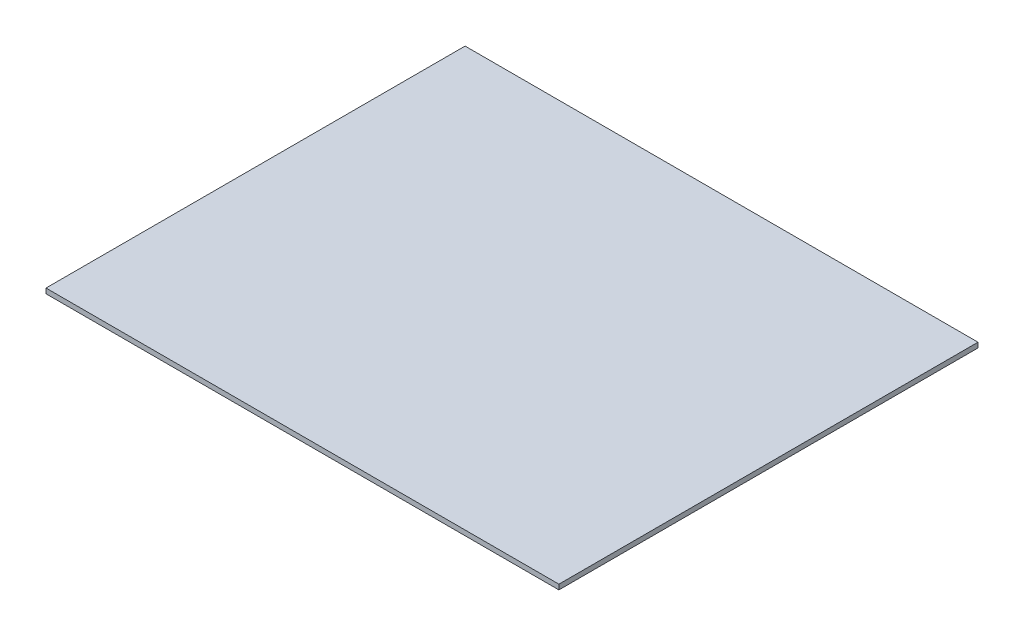
ISO-10303-21;
HEADER;
FILE_DESCRIPTION(('STEP AP214'),'2;1');
FILE_NAME('part.step','',(''),(''),'','','');
FILE_SCHEMA(('AUTOMOTIVE_DESIGN { 1 0 10303 214 1 1 1 1 }'));
ENDSEC;
DATA;
#1=APPLICATION_CONTEXT('core data for automotive mechanical design processes');
#2=APPLICATION_PROTOCOL_DEFINITION('international standard','automotive_design',2000,#1);
#3=PRODUCT_CONTEXT('',#1,'mechanical');
#4=PRODUCT('Part','Part','',(#3));
#5=PRODUCT_RELATED_PRODUCT_CATEGORY('part','',(#4));
#6=PRODUCT_DEFINITION_FORMATION('','',#4);
#7=PRODUCT_DEFINITION_CONTEXT('part definition',#1,'design');
#8=PRODUCT_DEFINITION('design','',#6,#7);
#9=PRODUCT_DEFINITION_SHAPE('','',#8);
#10=(LENGTH_UNIT() NAMED_UNIT(*) SI_UNIT(.MILLI.,.METRE.));
#11=(NAMED_UNIT(*) PLANE_ANGLE_UNIT() SI_UNIT($,.RADIAN.));
#12=(NAMED_UNIT(*) SI_UNIT($,.STERADIAN.) SOLID_ANGLE_UNIT());
#13=UNCERTAINTY_MEASURE_WITH_UNIT(LENGTH_MEASURE(1.E-05),#10,'distance_accuracy_value','');
#14=(GEOMETRIC_REPRESENTATION_CONTEXT(3) GLOBAL_UNCERTAINTY_ASSIGNED_CONTEXT((#13)) GLOBAL_UNIT_ASSIGNED_CONTEXT((#10,
#11,#12)) REPRESENTATION_CONTEXT('',''));
#15=CARTESIAN_POINT('',(0.,0.,0.));
#16=DIRECTION('',(0.,0.,1.));
#17=DIRECTION('',(1.,0.,0.));
#18=AXIS2_PLACEMENT_3D('',#15,#16,#17);
#19=CARTESIAN_POINT('',(205.,4.,-167.5));
#20=DIRECTION('',(-1.,0.,0.));
#21=DIRECTION('',(0.,0.,1.));
#22=AXIS2_PLACEMENT_3D('',#19,#20,#21);
#23=PLANE('',#22);
#24=DIRECTION('',(0.,0.,-1.));
#25=VECTOR('',#24,1.);
#26=CARTESIAN_POINT('',(205.,0.,-167.5));
#27=LINE('',#26,#25);
#28=CARTESIAN_POINT('',(205.,0.,167.5));
#29=VERTEX_POINT('',#28);
#30=CARTESIAN_POINT('',(205.,0.,-167.5));
#31=VERTEX_POINT('',#30);
#32=EDGE_CURVE('E101',#29,#31,#27,.T.);
#33=ORIENTED_EDGE('',*,*,#32,.T.);
#34=DIRECTION('',(0.,-1.,0.));
#35=VECTOR('',#34,1.);
#36=CARTESIAN_POINT('',(205.,4.,-167.5));
#37=LINE('',#36,#35);
#38=CARTESIAN_POINT('',(205.,4.,-167.5));
#39=VERTEX_POINT('',#38);
#40=EDGE_CURVE('E11',#39,#31,#37,.T.);
#41=ORIENTED_EDGE('',*,*,#40,.F.);
#42=DIRECTION('',(0.,0.,-1.));
#43=VECTOR('',#42,1.);
#44=CARTESIAN_POINT('',(205.,4.,-167.5));
#45=LINE('',#44,#43);
#46=CARTESIAN_POINT('',(205.,4.,167.5));
#47=VERTEX_POINT('',#46);
#48=EDGE_CURVE('E89',#47,#39,#45,.T.);
#49=ORIENTED_EDGE('',*,*,#48,.F.);
#50=DIRECTION('',(0.,-1.,0.));
#51=VECTOR('',#50,1.);
#52=CARTESIAN_POINT('',(205.,4.,167.5));
#53=LINE('',#52,#51);
#54=EDGE_CURVE('E97',#47,#29,#53,.T.);
#55=ORIENTED_EDGE('',*,*,#54,.T.);
#56=EDGE_LOOP('',(#33,#41,#49,#55));
#57=FACE_BOUND('',#56,.T.);
#58=ADVANCED_FACE('F38',(#57),#23,.F.);
#59=CARTESIAN_POINT('',(-205.,4.,-167.5));
#60=DIRECTION('',(0.,0.,1.));
#61=DIRECTION('',(1.,0.,0.));
#62=AXIS2_PLACEMENT_3D('',#59,#60,#61);
#63=PLANE('',#62);
#64=DIRECTION('',(-1.,0.,0.));
#65=VECTOR('',#64,1.);
#66=CARTESIAN_POINT('',(-205.,0.,-167.5));
#67=LINE('',#66,#65);
#68=CARTESIAN_POINT('',(-205.,0.,-167.5));
#69=VERTEX_POINT('',#68);
#70=EDGE_CURVE('E93',#31,#69,#67,.T.);
#71=ORIENTED_EDGE('',*,*,#70,.T.);
#72=DIRECTION('',(0.,-1.,0.));
#73=VECTOR('',#72,1.);
#74=CARTESIAN_POINT('',(-205.,4.,-167.5));
#75=LINE('',#74,#73);
#76=CARTESIAN_POINT('',(-205.,4.,-167.5));
#77=VERTEX_POINT('',#76);
#78=EDGE_CURVE('E46',#77,#69,#75,.T.);
#79=ORIENTED_EDGE('',*,*,#78,.F.);
#80=DIRECTION('',(-1.,0.,0.));
#81=VECTOR('',#80,1.);
#82=CARTESIAN_POINT('',(-205.,4.,-167.5));
#83=LINE('',#82,#81);
#84=EDGE_CURVE('E84',#39,#77,#83,.T.);
#85=ORIENTED_EDGE('',*,*,#84,.F.);
#86=ORIENTED_EDGE('',*,*,#40,.T.);
#87=EDGE_LOOP('',(#71,#79,#85,#86));
#88=FACE_BOUND('',#87,.T.);
#89=ADVANCED_FACE('F92',(#88),#63,.F.);
#90=CARTESIAN_POINT('',(-205.,4.,-167.5));
#91=DIRECTION('',(1.,0.,0.));
#92=DIRECTION('',(0.,0.,-1.));
#93=AXIS2_PLACEMENT_3D('',#90,#91,#92);
#94=PLANE('',#93);
#95=DIRECTION('',(0.,0.,1.));
#96=VECTOR('',#95,1.);
#97=CARTESIAN_POINT('',(-205.,0.,-167.5));
#98=LINE('',#97,#96);
#99=CARTESIAN_POINT('',(-205.,0.,167.5));
#100=VERTEX_POINT('',#99);
#101=EDGE_CURVE('E71',#69,#100,#98,.T.);
#102=ORIENTED_EDGE('',*,*,#101,.T.);
#103=DIRECTION('',(0.,-1.,0.));
#104=VECTOR('',#103,1.);
#105=CARTESIAN_POINT('',(-205.,4.,167.5));
#106=LINE('',#105,#104);
#107=CARTESIAN_POINT('',(-205.,4.,167.5));
#108=VERTEX_POINT('',#107);
#109=EDGE_CURVE('E94',#108,#100,#106,.T.);
#110=ORIENTED_EDGE('',*,*,#109,.F.);
#111=DIRECTION('',(0.,0.,1.));
#112=VECTOR('',#111,1.);
#113=CARTESIAN_POINT('',(-205.,4.,-167.5));
#114=LINE('',#113,#112);
#115=EDGE_CURVE('E87',#77,#108,#114,.T.);
#116=ORIENTED_EDGE('',*,*,#115,.F.);
#117=ORIENTED_EDGE('',*,*,#78,.T.);
#118=EDGE_LOOP('',(#102,#110,#116,#117));
#119=FACE_BOUND('',#118,.T.);
#120=ADVANCED_FACE('F95',(#119),#94,.F.);
#121=CARTESIAN_POINT('',(-205.,4.,167.5));
#122=DIRECTION('',(0.,0.,-1.));
#123=DIRECTION('',(-1.,0.,0.));
#124=AXIS2_PLACEMENT_3D('',#121,#122,#123);
#125=PLANE('',#124);
#126=DIRECTION('',(1.,0.,0.));
#127=VECTOR('',#126,1.);
#128=CARTESIAN_POINT('',(-205.,0.,167.5));
#129=LINE('',#128,#127);
#130=EDGE_CURVE('E77',#100,#29,#129,.T.);
#131=ORIENTED_EDGE('',*,*,#130,.T.);
#132=ORIENTED_EDGE('',*,*,#54,.F.);
#133=DIRECTION('',(1.,0.,0.));
#134=VECTOR('',#133,1.);
#135=CARTESIAN_POINT('',(-205.,4.,167.5));
#136=LINE('',#135,#134);
#137=EDGE_CURVE('E54',#108,#47,#136,.T.);
#138=ORIENTED_EDGE('',*,*,#137,.F.);
#139=ORIENTED_EDGE('',*,*,#109,.T.);
#140=EDGE_LOOP('',(#131,#132,#138,#139));
#141=FACE_BOUND('',#140,.T.);
#142=ADVANCED_FACE('F108',(#141),#125,.F.);
#143=CARTESIAN_POINT('',(0.,4.,0.));
#144=DIRECTION('',(0.,1.,0.));
#145=DIRECTION('',(0.,0.,1.));
#146=AXIS2_PLACEMENT_3D('',#143,#144,#145);
#147=PLANE('',#146);
#148=ORIENTED_EDGE('',*,*,#48,.T.);
#149=ORIENTED_EDGE('',*,*,#84,.T.);
#150=ORIENTED_EDGE('',*,*,#115,.T.);
#151=ORIENTED_EDGE('',*,*,#137,.T.);
#152=EDGE_LOOP('',(#148,#149,#150,#151));
#153=FACE_BOUND('',#152,.T.);
#154=ADVANCED_FACE('F85',(#153),#147,.T.);
#155=CARTESIAN_POINT('',(0.,0.,0.));
#156=DIRECTION('',(0.,1.,0.));
#157=DIRECTION('',(0.,0.,1.));
#158=AXIS2_PLACEMENT_3D('',#155,#156,#157);
#159=PLANE('',#158);
#160=ORIENTED_EDGE('',*,*,#32,.F.);
#161=ORIENTED_EDGE('',*,*,#130,.F.);
#162=ORIENTED_EDGE('',*,*,#101,.F.);
#163=ORIENTED_EDGE('',*,*,#70,.F.);
#164=EDGE_LOOP('',(#160,#161,#162,#163));
#165=FACE_BOUND('',#164,.T.);
#166=ADVANCED_FACE('F111',(#165),#159,.F.);
#167=CLOSED_SHELL('',(#58,#89,#120,#142,#154,#166));
#168=MANIFOLD_SOLID_BREP('B2',#167);
#169=ADVANCED_BREP_SHAPE_REPRESENTATION('',(#18,#168),#14);
#170=SHAPE_DEFINITION_REPRESENTATION(#9,#169);
ENDSEC;
END-ISO-10303-21;
